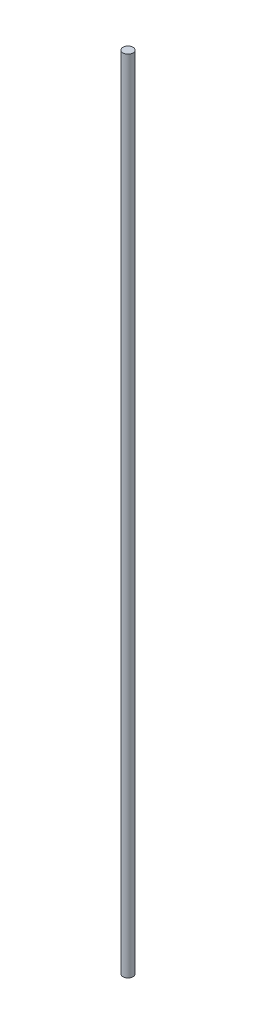
ISO-10303-21;
HEADER;
FILE_DESCRIPTION(('STEP AP214'),'2;1');
FILE_NAME('part.step','',(''),(''),'','','');
FILE_SCHEMA(('AUTOMOTIVE_DESIGN { 1 0 10303 214 1 1 1 1 }'));
ENDSEC;
DATA;
#1=APPLICATION_CONTEXT('core data for automotive mechanical design processes');
#2=APPLICATION_PROTOCOL_DEFINITION('international standard','automotive_design',2000,#1);
#3=PRODUCT_CONTEXT('',#1,'mechanical');
#4=PRODUCT('Part','Part','',(#3));
#5=PRODUCT_RELATED_PRODUCT_CATEGORY('part','',(#4));
#6=PRODUCT_DEFINITION_FORMATION('','',#4);
#7=PRODUCT_DEFINITION_CONTEXT('part definition',#1,'design');
#8=PRODUCT_DEFINITION('design','',#6,#7);
#9=PRODUCT_DEFINITION_SHAPE('','',#8);
#10=(LENGTH_UNIT() NAMED_UNIT(*) SI_UNIT(.MILLI.,.METRE.));
#11=(NAMED_UNIT(*) PLANE_ANGLE_UNIT() SI_UNIT($,.RADIAN.));
#12=(NAMED_UNIT(*) SI_UNIT($,.STERADIAN.) SOLID_ANGLE_UNIT());
#13=UNCERTAINTY_MEASURE_WITH_UNIT(LENGTH_MEASURE(1.E-05),#10,'distance_accuracy_value','');
#14=(GEOMETRIC_REPRESENTATION_CONTEXT(3) GLOBAL_UNCERTAINTY_ASSIGNED_CONTEXT((#13)) GLOBAL_UNIT_ASSIGNED_CONTEXT((#10,
#11,#12)) REPRESENTATION_CONTEXT('',''));
#15=CARTESIAN_POINT('',(0.,0.,0.));
#16=DIRECTION('',(0.,0.,1.));
#17=DIRECTION('',(1.,0.,0.));
#18=AXIS2_PLACEMENT_3D('',#15,#16,#17);
#19=CARTESIAN_POINT('',(0.,160.,0.));
#20=DIRECTION('',(0.,-1.,0.));
#21=DIRECTION('',(0.,0.,-1.));
#22=AXIS2_PLACEMENT_3D('',#19,#20,#21);
#23=CYLINDRICAL_SURFACE('',#22,1.);
#24=CARTESIAN_POINT('',(0.,160.,0.));
#25=DIRECTION('',(0.,1.,0.));
#26=DIRECTION('',(0.,0.,1.));
#27=AXIS2_PLACEMENT_3D('',#24,#25,#26);
#28=CIRCLE('',#27,1.);
#29=CARTESIAN_POINT('',(0.,160.,1.));
#30=VERTEX_POINT('',#29);
#31=EDGE_CURVE('E10',#30,#30,#28,.T.);
#32=ORIENTED_EDGE('',*,*,#31,.F.);
#33=EDGE_LOOP('',(#32));
#34=FACE_BOUND('',#33,.T.);
#35=CARTESIAN_POINT('',(0.,0.,0.));
#36=DIRECTION('',(0.,1.,0.));
#37=DIRECTION('',(0.,0.,1.));
#38=AXIS2_PLACEMENT_3D('',#35,#36,#37);
#39=CIRCLE('',#38,1.);
#40=CARTESIAN_POINT('',(0.,0.,1.));
#41=VERTEX_POINT('',#40);
#42=EDGE_CURVE('E40',#41,#41,#39,.T.);
#43=ORIENTED_EDGE('',*,*,#42,.T.);
#44=EDGE_LOOP('',(#43));
#45=FACE_BOUND('',#44,.T.);
#46=ADVANCED_FACE('F37',(#34,#45),#23,.T.);
#47=CARTESIAN_POINT('',(0.,160.,0.));
#48=DIRECTION('',(0.,1.,0.));
#49=DIRECTION('',(0.,0.,1.));
#50=AXIS2_PLACEMENT_3D('',#47,#48,#49);
#51=PLANE('',#50);
#52=ORIENTED_EDGE('',*,*,#31,.T.);
#53=EDGE_LOOP('',(#52));
#54=FACE_BOUND('',#53,.T.);
#55=ADVANCED_FACE('F52',(#54),#51,.T.);
#56=CARTESIAN_POINT('',(0.,0.,0.));
#57=DIRECTION('',(0.,1.,0.));
#58=DIRECTION('',(0.,0.,1.));
#59=AXIS2_PLACEMENT_3D('',#56,#57,#58);
#60=PLANE('',#59);
#61=ORIENTED_EDGE('',*,*,#42,.F.);
#62=EDGE_LOOP('',(#61));
#63=FACE_BOUND('',#62,.T.);
#64=ADVANCED_FACE('F50',(#63),#60,.F.);
#65=CLOSED_SHELL('',(#46,#55,#64));
#66=MANIFOLD_SOLID_BREP('B2',#65);
#67=ADVANCED_BREP_SHAPE_REPRESENTATION('',(#18,#66),#14);
#68=SHAPE_DEFINITION_REPRESENTATION(#9,#67);
ENDSEC;
END-ISO-10303-21;
